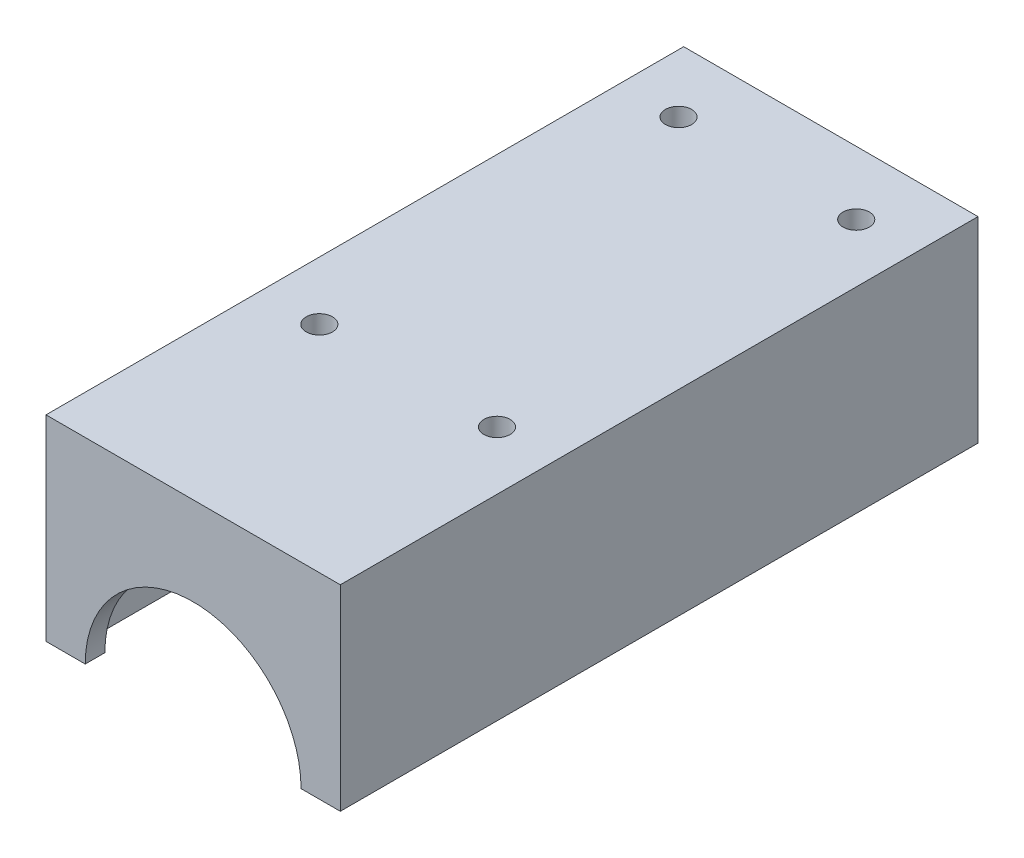
ISO-10303-21;
HEADER;
FILE_DESCRIPTION(('STEP AP214'),'2;1');
FILE_NAME('part.step','',(''),(''),'','','');
FILE_SCHEMA(('AUTOMOTIVE_DESIGN { 1 0 10303 214 1 1 1 1 }'));
ENDSEC;
DATA;
#1=APPLICATION_CONTEXT('core data for automotive mechanical design processes');
#2=APPLICATION_PROTOCOL_DEFINITION('international standard','automotive_design',2000,#1);
#3=PRODUCT_CONTEXT('',#1,'mechanical');
#4=PRODUCT('Part','Part','',(#3));
#5=PRODUCT_RELATED_PRODUCT_CATEGORY('part','',(#4));
#6=PRODUCT_DEFINITION_FORMATION('','',#4);
#7=PRODUCT_DEFINITION_CONTEXT('part definition',#1,'design');
#8=PRODUCT_DEFINITION('design','',#6,#7);
#9=PRODUCT_DEFINITION_SHAPE('','',#8);
#10=(LENGTH_UNIT() NAMED_UNIT(*) SI_UNIT(.MILLI.,.METRE.));
#11=(NAMED_UNIT(*) PLANE_ANGLE_UNIT() SI_UNIT($,.RADIAN.));
#12=(NAMED_UNIT(*) SI_UNIT($,.STERADIAN.) SOLID_ANGLE_UNIT());
#13=UNCERTAINTY_MEASURE_WITH_UNIT(LENGTH_MEASURE(1.E-05),#10,'distance_accuracy_value','');
#14=(GEOMETRIC_REPRESENTATION_CONTEXT(3) GLOBAL_UNCERTAINTY_ASSIGNED_CONTEXT((#13)) GLOBAL_UNIT_ASSIGNED_CONTEXT((#10,
#11,#12)) REPRESENTATION_CONTEXT('',''));
#15=CARTESIAN_POINT('',(0.,0.,0.));
#16=DIRECTION('',(0.,0.,1.));
#17=DIRECTION('',(1.,0.,0.));
#18=AXIS2_PLACEMENT_3D('',#15,#16,#17);
#19=CARTESIAN_POINT('',(0.,10.16,0.));
#20=DIRECTION('',(0.,-1.,0.));
#21=DIRECTION('',(0.,0.,-1.));
#22=AXIS2_PLACEMENT_3D('',#19,#20,#21);
#23=PLANE('',#22);
#24=CARTESIAN_POINT('',(-11.5,10.16,-33.06));
#25=DIRECTION('',(0.,-1.,0.));
#26=DIRECTION('',(1.,0.,0.));
#27=AXIS2_PLACEMENT_3D('',#24,#25,#26);
#28=CIRCLE('',#27,2.97);
#29=CARTESIAN_POINT('',(-8.53,10.16,-33.06));
#30=VERTEX_POINT('',#29);
#31=EDGE_CURVE('E386',#30,#30,#28,.T.);
#32=ORIENTED_EDGE('',*,*,#31,.F.);
#33=EDGE_LOOP('',(#32));
#34=FACE_BOUND('',#33,.T.);
#35=CARTESIAN_POINT('',(11.5,10.16,13.44));
#36=DIRECTION('',(0.,-1.,0.));
#37=DIRECTION('',(1.,0.,0.));
#38=AXIS2_PLACEMENT_3D('',#35,#36,#37);
#39=CIRCLE('',#38,2.97);
#40=CARTESIAN_POINT('',(14.47,10.16,13.44));
#41=VERTEX_POINT('',#40);
#42=EDGE_CURVE('E404',#41,#41,#39,.T.);
#43=ORIENTED_EDGE('',*,*,#42,.F.);
#44=EDGE_LOOP('',(#43));
#45=FACE_BOUND('',#44,.T.);
#46=DIRECTION('',(0.,0.,-1.));
#47=VECTOR('',#46,1.);
#48=CARTESIAN_POINT('',(16.51,10.16,0.));
#49=LINE('',#48,#47);
#50=CARTESIAN_POINT('',(16.51,10.16,38.735));
#51=VERTEX_POINT('',#50);
#52=CARTESIAN_POINT('',(16.51,10.16,-38.735));
#53=VERTEX_POINT('',#52);
#54=EDGE_CURVE('E455',#51,#53,#49,.T.);
#55=ORIENTED_EDGE('',*,*,#54,.F.);
#56=DIRECTION('',(1.,0.,0.));
#57=VECTOR('',#56,1.);
#58=CARTESIAN_POINT('',(0.,10.16,38.735));
#59=LINE('',#58,#57);
#60=CARTESIAN_POINT('',(-16.51,10.16,38.735));
#61=VERTEX_POINT('',#60);
#62=EDGE_CURVE('E466',#61,#51,#59,.T.);
#63=ORIENTED_EDGE('',*,*,#62,.F.);
#64=DIRECTION('',(0.,0.,1.));
#65=VECTOR('',#64,1.);
#66=CARTESIAN_POINT('',(-16.51,10.16,0.));
#67=LINE('',#66,#65);
#68=CARTESIAN_POINT('',(-16.51,10.16,-38.735));
#69=VERTEX_POINT('',#68);
#70=EDGE_CURVE('E472',#69,#61,#67,.T.);
#71=ORIENTED_EDGE('',*,*,#70,.F.);
#72=DIRECTION('',(-1.,0.,0.));
#73=VECTOR('',#72,1.);
#74=CARTESIAN_POINT('',(0.,10.16,-38.735));
#75=LINE('',#74,#73);
#76=EDGE_CURVE('E459',#53,#69,#75,.T.);
#77=ORIENTED_EDGE('',*,*,#76,.F.);
#78=EDGE_LOOP('',(#55,#63,#71,#77));
#79=FACE_BOUND('',#78,.T.);
#80=CARTESIAN_POINT('',(-11.5,10.16,13.44));
#81=DIRECTION('',(0.,-1.,0.));
#82=DIRECTION('',(1.,0.,0.));
#83=AXIS2_PLACEMENT_3D('',#80,#81,#82);
#84=CIRCLE('',#83,2.97);
#85=CARTESIAN_POINT('',(-8.53,10.16,13.44));
#86=VERTEX_POINT('',#85);
#87=EDGE_CURVE('E372',#86,#86,#84,.T.);
#88=ORIENTED_EDGE('',*,*,#87,.F.);
#89=EDGE_LOOP('',(#88));
#90=FACE_BOUND('',#89,.T.);
#91=CARTESIAN_POINT('',(11.5,10.16,-33.06));
#92=DIRECTION('',(0.,-1.,0.));
#93=DIRECTION('',(1.,0.,0.));
#94=AXIS2_PLACEMENT_3D('',#91,#92,#93);
#95=CIRCLE('',#94,2.97);
#96=CARTESIAN_POINT('',(14.47,10.16,-33.06));
#97=VERTEX_POINT('',#96);
#98=EDGE_CURVE('E397',#97,#97,#95,.T.);
#99=ORIENTED_EDGE('',*,*,#98,.F.);
#100=EDGE_LOOP('',(#99));
#101=FACE_BOUND('',#100,.T.);
#102=ADVANCED_FACE('F69',(#34,#45,#79,#90,#101),#23,.T.);
#103=CARTESIAN_POINT('',(0.,-12.7,0.));
#104=DIRECTION('',(0.,-1.,0.));
#105=DIRECTION('',(0.,0.,-1.));
#106=AXIS2_PLACEMENT_3D('',#103,#104,#105);
#107=PLANE('',#106);
#108=DIRECTION('',(0.,0.,-1.));
#109=VECTOR('',#108,1.);
#110=CARTESIAN_POINT('',(-13.97,-12.7,41.275));
#111=LINE('',#110,#109);
#112=CARTESIAN_POINT('',(-13.97,-12.7,41.275));
#113=VERTEX_POINT('',#112);
#114=CARTESIAN_POINT('',(-13.97,-12.7,38.735));
#115=VERTEX_POINT('',#114);
#116=EDGE_CURVE('E441',#113,#115,#111,.T.);
#117=ORIENTED_EDGE('',*,*,#116,.F.);
#118=DIRECTION('',(1.,0.,0.));
#119=VECTOR('',#118,1.);
#120=CARTESIAN_POINT('',(-19.05,-12.7,41.275));
#121=LINE('',#120,#119);
#122=CARTESIAN_POINT('',(-19.05,-12.7,41.275));
#123=VERTEX_POINT('',#122);
#124=EDGE_CURVE('E501',#123,#113,#121,.T.);
#125=ORIENTED_EDGE('',*,*,#124,.F.);
#126=DIRECTION('',(0.,0.,1.));
#127=VECTOR('',#126,1.);
#128=CARTESIAN_POINT('',(-19.05,-12.7,41.275));
#129=LINE('',#128,#127);
#130=CARTESIAN_POINT('',(-19.05,-12.7,-41.275));
#131=VERTEX_POINT('',#130);
#132=EDGE_CURVE('E519',#131,#123,#129,.T.);
#133=ORIENTED_EDGE('',*,*,#132,.F.);
#134=DIRECTION('',(-1.,0.,0.));
#135=VECTOR('',#134,1.);
#136=CARTESIAN_POINT('',(-19.05,-12.7,-41.275));
#137=LINE('',#136,#135);
#138=CARTESIAN_POINT('',(-13.97,-12.7,-41.275));
#139=VERTEX_POINT('',#138);
#140=EDGE_CURVE('E514',#139,#131,#137,.T.);
#141=ORIENTED_EDGE('',*,*,#140,.F.);
#142=CARTESIAN_POINT('',(-13.97,-12.7,-38.735));
#143=VERTEX_POINT('',#142);
#144=EDGE_CURVE('E446',#143,#139,#111,.T.);
#145=ORIENTED_EDGE('',*,*,#144,.F.);
#146=DIRECTION('',(-1.,0.,0.));
#147=VECTOR('',#146,1.);
#148=CARTESIAN_POINT('',(0.,-12.7,-38.735));
#149=LINE('',#148,#147);
#150=CARTESIAN_POINT('',(-16.51,-12.7,-38.735));
#151=VERTEX_POINT('',#150);
#152=EDGE_CURVE('E483',#143,#151,#149,.T.);
#153=ORIENTED_EDGE('',*,*,#152,.T.);
#154=DIRECTION('',(0.,0.,1.));
#155=VECTOR('',#154,1.);
#156=CARTESIAN_POINT('',(-16.51,-12.7,0.));
#157=LINE('',#156,#155);
#158=CARTESIAN_POINT('',(-16.51,-12.7,38.735));
#159=VERTEX_POINT('',#158);
#160=EDGE_CURVE('E488',#151,#159,#157,.T.);
#161=ORIENTED_EDGE('',*,*,#160,.T.);
#162=DIRECTION('',(1.,0.,0.));
#163=VECTOR('',#162,1.);
#164=CARTESIAN_POINT('',(0.,-12.7,38.735));
#165=LINE('',#164,#163);
#166=EDGE_CURVE('E460',#159,#115,#165,.T.);
#167=ORIENTED_EDGE('',*,*,#166,.T.);
#168=EDGE_LOOP('',(#117,#125,#133,#141,#145,#153,#161,#167));
#169=FACE_BOUND('',#168,.T.);
#170=ADVANCED_FACE('F595',(#169),#107,.T.);
#171=DIRECTION('',(0.,0.,-1.));
#172=VECTOR('',#171,1.);
#173=CARTESIAN_POINT('',(13.97,-12.7,41.275));
#174=LINE('',#173,#172);
#175=CARTESIAN_POINT('',(13.97,-12.7,-41.275));
#176=VERTEX_POINT('',#175);
#177=CARTESIAN_POINT('',(13.97,-12.7,-38.735));
#178=VERTEX_POINT('',#177);
#179=EDGE_CURVE('E442',#176,#178,#174,.F.);
#180=ORIENTED_EDGE('',*,*,#179,.F.);
#181=CARTESIAN_POINT('',(19.05,-12.7,-41.275));
#182=VERTEX_POINT('',#181);
#183=EDGE_CURVE('E515',#182,#176,#137,.T.);
#184=ORIENTED_EDGE('',*,*,#183,.F.);
#185=DIRECTION('',(0.,0.,-1.));
#186=VECTOR('',#185,1.);
#187=CARTESIAN_POINT('',(19.05,-12.7,41.275));
#188=LINE('',#187,#186);
#189=CARTESIAN_POINT('',(19.05,-12.7,41.275));
#190=VERTEX_POINT('',#189);
#191=EDGE_CURVE('E453',#190,#182,#188,.T.);
#192=ORIENTED_EDGE('',*,*,#191,.F.);
#193=CARTESIAN_POINT('',(13.97,-12.7,41.275));
#194=VERTEX_POINT('',#193);
#195=EDGE_CURVE('E522',#194,#190,#121,.T.);
#196=ORIENTED_EDGE('',*,*,#195,.F.);
#197=CARTESIAN_POINT('',(13.97,-12.7,38.735));
#198=VERTEX_POINT('',#197);
#199=EDGE_CURVE('E436',#198,#194,#174,.F.);
#200=ORIENTED_EDGE('',*,*,#199,.F.);
#201=CARTESIAN_POINT('',(16.51,-12.7,38.735));
#202=VERTEX_POINT('',#201);
#203=EDGE_CURVE('E487',#198,#202,#165,.T.);
#204=ORIENTED_EDGE('',*,*,#203,.T.);
#205=DIRECTION('',(0.,0.,-1.));
#206=VECTOR('',#205,1.);
#207=CARTESIAN_POINT('',(16.51,-12.7,0.));
#208=LINE('',#207,#206);
#209=CARTESIAN_POINT('',(16.51,-12.7,-38.735));
#210=VERTEX_POINT('',#209);
#211=EDGE_CURVE('E479',#202,#210,#208,.T.);
#212=ORIENTED_EDGE('',*,*,#211,.T.);
#213=EDGE_CURVE('E492',#210,#178,#149,.T.);
#214=ORIENTED_EDGE('',*,*,#213,.T.);
#215=EDGE_LOOP('',(#180,#184,#192,#196,#200,#204,#212,#214));
#216=FACE_BOUND('',#215,.T.);
#217=ADVANCED_FACE('F603',(#216),#107,.T.);
#218=CARTESIAN_POINT('',(19.05,12.7,41.275));
#219=DIRECTION('',(-1.,0.,0.));
#220=DIRECTION('',(0.,0.,1.));
#221=AXIS2_PLACEMENT_3D('',#218,#219,#220);
#222=PLANE('',#221);
#223=ORIENTED_EDGE('',*,*,#191,.T.);
#224=DIRECTION('',(0.,-1.,0.));
#225=VECTOR('',#224,1.);
#226=CARTESIAN_POINT('',(19.05,12.7,-41.275));
#227=LINE('',#226,#225);
#228=CARTESIAN_POINT('',(19.05,12.7,-41.275));
#229=VERTEX_POINT('',#228);
#230=EDGE_CURVE('E537',#229,#182,#227,.T.);
#231=ORIENTED_EDGE('',*,*,#230,.F.);
#232=DIRECTION('',(0.,0.,-1.));
#233=VECTOR('',#232,1.);
#234=CARTESIAN_POINT('',(19.05,12.7,41.275));
#235=LINE('',#234,#233);
#236=CARTESIAN_POINT('',(19.05,12.7,41.275));
#237=VERTEX_POINT('',#236);
#238=EDGE_CURVE('E496',#237,#229,#235,.T.);
#239=ORIENTED_EDGE('',*,*,#238,.F.);
#240=DIRECTION('',(0.,-1.,0.));
#241=VECTOR('',#240,1.);
#242=CARTESIAN_POINT('',(19.05,12.7,41.275));
#243=LINE('',#242,#241);
#244=EDGE_CURVE('E510',#237,#190,#243,.T.);
#245=ORIENTED_EDGE('',*,*,#244,.T.);
#246=EDGE_LOOP('',(#223,#231,#239,#245));
#247=FACE_BOUND('',#246,.T.);
#248=ADVANCED_FACE('F71',(#247),#222,.F.);
#249=CARTESIAN_POINT('',(-19.05,12.7,-41.275));
#250=DIRECTION('',(0.,0.,1.));
#251=DIRECTION('',(1.,0.,0.));
#252=AXIS2_PLACEMENT_3D('',#249,#250,#251);
#253=PLANE('',#252);
#254=ORIENTED_EDGE('',*,*,#183,.T.);
#255=CARTESIAN_POINT('',(0.,-12.7,-41.275));
#256=DIRECTION('',(0.,0.,-1.));
#257=DIRECTION('',(-1.,0.,0.));
#258=AXIS2_PLACEMENT_3D('',#255,#256,#257);
#259=CIRCLE('',#258,13.97);
#260=EDGE_CURVE('E431',#139,#176,#259,.T.);
#261=ORIENTED_EDGE('',*,*,#260,.F.);
#262=ORIENTED_EDGE('',*,*,#140,.T.);
#263=DIRECTION('',(0.,-1.,0.));
#264=VECTOR('',#263,1.);
#265=CARTESIAN_POINT('',(-19.05,12.7,-41.275));
#266=LINE('',#265,#264);
#267=CARTESIAN_POINT('',(-19.05,12.7,-41.275));
#268=VERTEX_POINT('',#267);
#269=EDGE_CURVE('E533',#268,#131,#266,.T.);
#270=ORIENTED_EDGE('',*,*,#269,.F.);
#271=DIRECTION('',(-1.,0.,0.));
#272=VECTOR('',#271,1.);
#273=CARTESIAN_POINT('',(-19.05,12.7,-41.275));
#274=LINE('',#273,#272);
#275=EDGE_CURVE('E500',#229,#268,#274,.T.);
#276=ORIENTED_EDGE('',*,*,#275,.F.);
#277=ORIENTED_EDGE('',*,*,#230,.T.);
#278=EDGE_LOOP('',(#254,#261,#262,#270,#276,#277));
#279=FACE_BOUND('',#278,.T.);
#280=ADVANCED_FACE('F624',(#279),#253,.F.);
#281=CARTESIAN_POINT('',(-19.05,12.7,41.275));
#282=DIRECTION('',(1.,0.,0.));
#283=DIRECTION('',(0.,0.,-1.));
#284=AXIS2_PLACEMENT_3D('',#281,#282,#283);
#285=PLANE('',#284);
#286=ORIENTED_EDGE('',*,*,#132,.T.);
#287=DIRECTION('',(0.,-1.,0.));
#288=VECTOR('',#287,1.);
#289=CARTESIAN_POINT('',(-19.05,12.7,41.275));
#290=LINE('',#289,#288);
#291=CARTESIAN_POINT('',(-19.05,12.7,41.275));
#292=VERTEX_POINT('',#291);
#293=EDGE_CURVE('E529',#292,#123,#290,.T.);
#294=ORIENTED_EDGE('',*,*,#293,.F.);
#295=DIRECTION('',(0.,0.,1.));
#296=VECTOR('',#295,1.);
#297=CARTESIAN_POINT('',(-19.05,12.7,41.275));
#298=LINE('',#297,#296);
#299=EDGE_CURVE('E504',#268,#292,#298,.T.);
#300=ORIENTED_EDGE('',*,*,#299,.F.);
#301=ORIENTED_EDGE('',*,*,#269,.T.);
#302=EDGE_LOOP('',(#286,#294,#300,#301));
#303=FACE_BOUND('',#302,.T.);
#304=ADVANCED_FACE('F621',(#303),#285,.F.);
#305=CARTESIAN_POINT('',(-19.05,12.7,41.275));
#306=DIRECTION('',(0.,0.,-1.));
#307=DIRECTION('',(-1.,0.,0.));
#308=AXIS2_PLACEMENT_3D('',#305,#306,#307);
#309=PLANE('',#308);
#310=ORIENTED_EDGE('',*,*,#124,.T.);
#311=CARTESIAN_POINT('',(0.,-12.7,41.275));
#312=DIRECTION('',(0.,0.,-1.));
#313=DIRECTION('',(-1.,0.,0.));
#314=AXIS2_PLACEMENT_3D('',#311,#312,#313);
#315=CIRCLE('',#314,13.97);
#316=EDGE_CURVE('E432',#113,#194,#315,.T.);
#317=ORIENTED_EDGE('',*,*,#316,.T.);
#318=ORIENTED_EDGE('',*,*,#195,.T.);
#319=ORIENTED_EDGE('',*,*,#244,.F.);
#320=DIRECTION('',(1.,0.,0.));
#321=VECTOR('',#320,1.);
#322=CARTESIAN_POINT('',(-19.05,12.7,41.275));
#323=LINE('',#322,#321);
#324=EDGE_CURVE('E507',#292,#237,#323,.T.);
#325=ORIENTED_EDGE('',*,*,#324,.F.);
#326=ORIENTED_EDGE('',*,*,#293,.T.);
#327=EDGE_LOOP('',(#310,#317,#318,#319,#325,#326));
#328=FACE_BOUND('',#327,.T.);
#329=ADVANCED_FACE('F614',(#328),#309,.F.);
#330=CARTESIAN_POINT('',(0.,12.7,0.));
#331=DIRECTION('',(0.,-1.,0.));
#332=DIRECTION('',(0.,0.,-1.));
#333=AXIS2_PLACEMENT_3D('',#330,#331,#332);
#334=PLANE('',#333);
#335=CARTESIAN_POINT('',(-11.5,12.7,13.44));
#336=DIRECTION('',(0.,-1.,0.));
#337=DIRECTION('',(0.,0.,-1.));
#338=AXIS2_PLACEMENT_3D('',#335,#336,#337);
#339=CIRCLE('',#338,1.7);
#340=CARTESIAN_POINT('',(-11.5,12.7,11.74));
#341=VERTEX_POINT('',#340);
#342=EDGE_CURVE('E415',#341,#341,#339,.T.);
#343=ORIENTED_EDGE('',*,*,#342,.T.);
#344=EDGE_LOOP('',(#343));
#345=FACE_BOUND('',#344,.T.);
#346=CARTESIAN_POINT('',(-11.5,12.7,-33.06));
#347=DIRECTION('',(0.,-1.,0.));
#348=DIRECTION('',(0.,0.,-1.));
#349=AXIS2_PLACEMENT_3D('',#346,#347,#348);
#350=CIRCLE('',#349,1.7);
#351=CARTESIAN_POINT('',(-11.5,12.7,-34.76));
#352=VERTEX_POINT('',#351);
#353=EDGE_CURVE('E421',#352,#352,#350,.T.);
#354=ORIENTED_EDGE('',*,*,#353,.T.);
#355=EDGE_LOOP('',(#354));
#356=FACE_BOUND('',#355,.T.);
#357=CARTESIAN_POINT('',(11.5,12.7,-33.06));
#358=DIRECTION('',(0.,-1.,0.));
#359=DIRECTION('',(0.,0.,-1.));
#360=AXIS2_PLACEMENT_3D('',#357,#358,#359);
#361=CIRCLE('',#360,1.7);
#362=CARTESIAN_POINT('',(11.5,12.7,-34.76));
#363=VERTEX_POINT('',#362);
#364=EDGE_CURVE('E416',#363,#363,#361,.T.);
#365=ORIENTED_EDGE('',*,*,#364,.T.);
#366=EDGE_LOOP('',(#365));
#367=FACE_BOUND('',#366,.T.);
#368=CARTESIAN_POINT('',(11.5,12.7,13.44));
#369=DIRECTION('',(0.,-1.,0.));
#370=DIRECTION('',(0.,0.,-1.));
#371=AXIS2_PLACEMENT_3D('',#368,#369,#370);
#372=CIRCLE('',#371,1.7);
#373=CARTESIAN_POINT('',(11.5,12.7,11.74));
#374=VERTEX_POINT('',#373);
#375=EDGE_CURVE('E420',#374,#374,#372,.T.);
#376=ORIENTED_EDGE('',*,*,#375,.T.);
#377=EDGE_LOOP('',(#376));
#378=FACE_BOUND('',#377,.T.);
#379=ORIENTED_EDGE('',*,*,#238,.T.);
#380=ORIENTED_EDGE('',*,*,#275,.T.);
#381=ORIENTED_EDGE('',*,*,#299,.T.);
#382=ORIENTED_EDGE('',*,*,#324,.T.);
#383=EDGE_LOOP('',(#379,#380,#381,#382));
#384=FACE_BOUND('',#383,.T.);
#385=ADVANCED_FACE('F612',(#345,#356,#367,#378,#384),#334,.F.);
#386=CARTESIAN_POINT('',(16.51,12.7,41.275));
#387=DIRECTION('',(-1.,0.,0.));
#388=DIRECTION('',(0.,0.,1.));
#389=AXIS2_PLACEMENT_3D('',#386,#387,#388);
#390=PLANE('',#389);
#391=ORIENTED_EDGE('',*,*,#211,.F.);
#392=DIRECTION('',(0.,-1.,0.));
#393=VECTOR('',#392,1.);
#394=CARTESIAN_POINT('',(16.51,12.7,38.735));
#395=LINE('',#394,#393);
#396=EDGE_CURVE('E461',#51,#202,#395,.T.);
#397=ORIENTED_EDGE('',*,*,#396,.F.);
#398=ORIENTED_EDGE('',*,*,#54,.T.);
#399=DIRECTION('',(0.,-1.,0.));
#400=VECTOR('',#399,1.);
#401=CARTESIAN_POINT('',(16.51,12.7,-38.735));
#402=LINE('',#401,#400);
#403=EDGE_CURVE('E449',#53,#210,#402,.T.);
#404=ORIENTED_EDGE('',*,*,#403,.T.);
#405=EDGE_LOOP('',(#391,#397,#398,#404));
#406=FACE_BOUND('',#405,.T.);
#407=ADVANCED_FACE('F613',(#406),#390,.T.);
#408=CARTESIAN_POINT('',(-19.05,12.7,-38.735));
#409=DIRECTION('',(0.,0.,1.));
#410=DIRECTION('',(1.,0.,0.));
#411=AXIS2_PLACEMENT_3D('',#408,#409,#410);
#412=PLANE('',#411);
#413=CARTESIAN_POINT('',(0.,-12.7,-38.735));
#414=DIRECTION('',(0.,0.,1.));
#415=DIRECTION('',(1.,0.,0.));
#416=AXIS2_PLACEMENT_3D('',#413,#414,#415);
#417=CIRCLE('',#416,13.97);
#418=EDGE_CURVE('E445',#178,#143,#417,.T.);
#419=ORIENTED_EDGE('',*,*,#418,.F.);
#420=ORIENTED_EDGE('',*,*,#213,.F.);
#421=ORIENTED_EDGE('',*,*,#403,.F.);
#422=ORIENTED_EDGE('',*,*,#76,.T.);
#423=DIRECTION('',(0.,-1.,0.));
#424=VECTOR('',#423,1.);
#425=CARTESIAN_POINT('',(-16.51,12.7,-38.735));
#426=LINE('',#425,#424);
#427=EDGE_CURVE('E454',#69,#151,#426,.T.);
#428=ORIENTED_EDGE('',*,*,#427,.T.);
#429=ORIENTED_EDGE('',*,*,#152,.F.);
#430=EDGE_LOOP('',(#419,#420,#421,#422,#428,#429));
#431=FACE_BOUND('',#430,.T.);
#432=ADVANCED_FACE('F649',(#431),#412,.T.);
#433=CARTESIAN_POINT('',(-16.51,12.7,41.275));
#434=DIRECTION('',(1.,0.,0.));
#435=DIRECTION('',(0.,0.,-1.));
#436=AXIS2_PLACEMENT_3D('',#433,#434,#435);
#437=PLANE('',#436);
#438=ORIENTED_EDGE('',*,*,#160,.F.);
#439=ORIENTED_EDGE('',*,*,#427,.F.);
#440=ORIENTED_EDGE('',*,*,#70,.T.);
#441=DIRECTION('',(0.,-1.,0.));
#442=VECTOR('',#441,1.);
#443=CARTESIAN_POINT('',(-16.51,12.7,38.735));
#444=LINE('',#443,#442);
#445=EDGE_CURVE('E465',#61,#159,#444,.T.);
#446=ORIENTED_EDGE('',*,*,#445,.T.);
#447=EDGE_LOOP('',(#438,#439,#440,#446));
#448=FACE_BOUND('',#447,.T.);
#449=ADVANCED_FACE('F679',(#448),#437,.T.);
#450=CARTESIAN_POINT('',(-19.05,12.7,38.735));
#451=DIRECTION('',(0.,0.,-1.));
#452=DIRECTION('',(-1.,0.,0.));
#453=AXIS2_PLACEMENT_3D('',#450,#451,#452);
#454=PLANE('',#453);
#455=CARTESIAN_POINT('',(0.,-12.7,38.735));
#456=DIRECTION('',(0.,0.,-1.));
#457=DIRECTION('',(-1.,0.,0.));
#458=AXIS2_PLACEMENT_3D('',#455,#456,#457);
#459=CIRCLE('',#458,13.97);
#460=EDGE_CURVE('E541',#115,#198,#459,.T.);
#461=ORIENTED_EDGE('',*,*,#460,.F.);
#462=ORIENTED_EDGE('',*,*,#166,.F.);
#463=ORIENTED_EDGE('',*,*,#445,.F.);
#464=ORIENTED_EDGE('',*,*,#62,.T.);
#465=ORIENTED_EDGE('',*,*,#396,.T.);
#466=ORIENTED_EDGE('',*,*,#203,.F.);
#467=EDGE_LOOP('',(#461,#462,#463,#464,#465,#466));
#468=FACE_BOUND('',#467,.T.);
#469=ADVANCED_FACE('F610',(#468),#454,.T.);
#470=CARTESIAN_POINT('',(0.,-12.7,41.275));
#471=DIRECTION('',(0.,0.,-1.));
#472=DIRECTION('',(-1.,0.,0.));
#473=AXIS2_PLACEMENT_3D('',#470,#471,#472);
#474=CYLINDRICAL_SURFACE('',#473,13.97);
#475=ORIENTED_EDGE('',*,*,#116,.T.);
#476=ORIENTED_EDGE('',*,*,#460,.T.);
#477=ORIENTED_EDGE('',*,*,#199,.T.);
#478=ORIENTED_EDGE('',*,*,#316,.F.);
#479=EDGE_LOOP('',(#475,#476,#477,#478));
#480=FACE_BOUND('',#479,.T.);
#481=ADVANCED_FACE('F667',(#480),#474,.F.);
#482=ORIENTED_EDGE('',*,*,#144,.T.);
#483=ORIENTED_EDGE('',*,*,#260,.T.);
#484=ORIENTED_EDGE('',*,*,#179,.T.);
#485=ORIENTED_EDGE('',*,*,#418,.T.);
#486=EDGE_LOOP('',(#482,#483,#484,#485));
#487=FACE_BOUND('',#486,.T.);
#488=ADVANCED_FACE('F643',(#487),#474,.F.);
#489=CARTESIAN_POINT('',(11.5,12.7,13.44));
#490=DIRECTION('',(0.,-1.,0.));
#491=DIRECTION('',(0.,0.,-1.));
#492=AXIS2_PLACEMENT_3D('',#489,#490,#491);
#493=CYLINDRICAL_SURFACE('',#492,1.7);
#494=CARTESIAN_POINT('',(11.5,-1.27,13.44));
#495=DIRECTION('',(0.,1.,0.));
#496=DIRECTION('',(-1.,0.,0.));
#497=AXIS2_PLACEMENT_3D('',#494,#495,#496);
#498=CIRCLE('',#497,1.7);
#499=CARTESIAN_POINT('',(10.16,-1.27,14.4861357464497));
#500=VERTEX_POINT('',#499);
#501=CARTESIAN_POINT('',(10.16,-1.27,12.3938642535503));
#502=VERTEX_POINT('',#501);
#503=EDGE_CURVE('E408',#500,#502,#498,.T.);
#504=ORIENTED_EDGE('',*,*,#503,.F.);
#505=DIRECTION('',(0.,-1.,0.));
#506=VECTOR('',#505,1.);
#507=CARTESIAN_POINT('',(10.16,12.7,14.4861357464497));
#508=LINE('',#507,#506);
#509=CARTESIAN_POINT('',(10.16,1.27,14.4861357464497));
#510=VERTEX_POINT('',#509);
#511=EDGE_CURVE('E320',#500,#510,#508,.F.);
#512=ORIENTED_EDGE('',*,*,#511,.T.);
#513=CARTESIAN_POINT('',(11.5,1.27,13.44));
#514=DIRECTION('',(0.,1.,0.));
#515=DIRECTION('',(-1.,0.,0.));
#516=AXIS2_PLACEMENT_3D('',#513,#514,#515);
#517=CIRCLE('',#516,1.7);
#518=CARTESIAN_POINT('',(10.16,1.27,12.3938642535502));
#519=VERTEX_POINT('',#518);
#520=EDGE_CURVE('E252',#510,#519,#517,.F.);
#521=ORIENTED_EDGE('',*,*,#520,.T.);
#522=DIRECTION('',(0.,-1.,0.));
#523=VECTOR('',#522,1.);
#524=CARTESIAN_POINT('',(10.16,12.7,12.3938642535503));
#525=LINE('',#524,#523);
#526=EDGE_CURVE('E316',#519,#502,#525,.T.);
#527=ORIENTED_EDGE('',*,*,#526,.T.);
#528=EDGE_LOOP('',(#504,#512,#521,#527));
#529=FACE_BOUND('',#528,.T.);
#530=ORIENTED_EDGE('',*,*,#375,.F.);
#531=EDGE_LOOP('',(#530));
#532=FACE_BOUND('',#531,.T.);
#533=ADVANCED_FACE('F710',(#529,#532),#493,.F.);
#534=CARTESIAN_POINT('',(11.5,12.7,-33.06));
#535=DIRECTION('',(0.,-1.,0.));
#536=DIRECTION('',(0.,0.,-1.));
#537=AXIS2_PLACEMENT_3D('',#534,#535,#536);
#538=CYLINDRICAL_SURFACE('',#537,1.7);
#539=ORIENTED_EDGE('',*,*,#364,.F.);
#540=EDGE_LOOP('',(#539));
#541=FACE_BOUND('',#540,.T.);
#542=CARTESIAN_POINT('',(11.5,-1.27,-33.06));
#543=DIRECTION('',(0.,1.,0.));
#544=DIRECTION('',(-1.,0.,0.));
#545=AXIS2_PLACEMENT_3D('',#542,#543,#544);
#546=CIRCLE('',#545,1.7);
#547=CARTESIAN_POINT('',(9.80000000000001,-1.27,-33.06));
#548=VERTEX_POINT('',#547);
#549=EDGE_CURVE('E367',#548,#548,#546,.T.);
#550=ORIENTED_EDGE('',*,*,#549,.F.);
#551=EDGE_LOOP('',(#550));
#552=FACE_BOUND('',#551,.T.);
#553=ADVANCED_FACE('F707',(#541,#552),#538,.F.);
#554=CARTESIAN_POINT('',(-11.5,12.7,-33.06));
#555=DIRECTION('',(0.,-1.,0.));
#556=DIRECTION('',(0.,0.,-1.));
#557=AXIS2_PLACEMENT_3D('',#554,#555,#556);
#558=CYLINDRICAL_SURFACE('',#557,1.7);
#559=ORIENTED_EDGE('',*,*,#353,.F.);
#560=EDGE_LOOP('',(#559));
#561=FACE_BOUND('',#560,.T.);
#562=CARTESIAN_POINT('',(-11.5,-1.27,-33.06));
#563=DIRECTION('',(0.,1.,0.));
#564=DIRECTION('',(-1.,0.,0.));
#565=AXIS2_PLACEMENT_3D('',#562,#563,#564);
#566=CIRCLE('',#565,1.7);
#567=CARTESIAN_POINT('',(-13.2,-1.27,-33.06));
#568=VERTEX_POINT('',#567);
#569=EDGE_CURVE('E382',#568,#568,#566,.T.);
#570=ORIENTED_EDGE('',*,*,#569,.F.);
#571=EDGE_LOOP('',(#570));
#572=FACE_BOUND('',#571,.T.);
#573=ADVANCED_FACE('F709',(#561,#572),#558,.F.);
#574=CARTESIAN_POINT('',(-11.5,12.7,13.44));
#575=DIRECTION('',(0.,-1.,0.));
#576=DIRECTION('',(0.,0.,-1.));
#577=AXIS2_PLACEMENT_3D('',#574,#575,#576);
#578=CYLINDRICAL_SURFACE('',#577,1.7);
#579=CARTESIAN_POINT('',(-11.5,-1.27,13.44));
#580=DIRECTION('',(0.,1.,0.));
#581=DIRECTION('',(-1.,0.,0.));
#582=AXIS2_PLACEMENT_3D('',#579,#580,#581);
#583=CIRCLE('',#582,1.7);
#584=CARTESIAN_POINT('',(-10.16,-1.27,12.3938642535502));
#585=VERTEX_POINT('',#584);
#586=CARTESIAN_POINT('',(-10.16,-1.27,14.4861357464498));
#587=VERTEX_POINT('',#586);
#588=EDGE_CURVE('E368',#585,#587,#583,.T.);
#589=ORIENTED_EDGE('',*,*,#588,.F.);
#590=DIRECTION('',(0.,-1.,0.));
#591=VECTOR('',#590,1.);
#592=CARTESIAN_POINT('',(-10.16,12.7,12.3938642535502));
#593=LINE('',#592,#591);
#594=CARTESIAN_POINT('',(-10.16,1.27,12.3938642535502));
#595=VERTEX_POINT('',#594);
#596=EDGE_CURVE('E363',#585,#595,#593,.F.);
#597=ORIENTED_EDGE('',*,*,#596,.T.);
#598=CARTESIAN_POINT('',(-11.5,1.27,13.44));
#599=DIRECTION('',(0.,1.,0.));
#600=DIRECTION('',(-1.,0.,0.));
#601=AXIS2_PLACEMENT_3D('',#598,#599,#600);
#602=CIRCLE('',#601,1.7);
#603=CARTESIAN_POINT('',(-10.16,1.27,14.4861357464498));
#604=VERTEX_POINT('',#603);
#605=EDGE_CURVE('E335',#595,#604,#602,.F.);
#606=ORIENTED_EDGE('',*,*,#605,.T.);
#607=DIRECTION('',(0.,-1.,0.));
#608=VECTOR('',#607,1.);
#609=CARTESIAN_POINT('',(-10.16,12.7,14.4861357464498));
#610=LINE('',#609,#608);
#611=EDGE_CURVE('E359',#604,#587,#610,.T.);
#612=ORIENTED_EDGE('',*,*,#611,.T.);
#613=EDGE_LOOP('',(#589,#597,#606,#612));
#614=FACE_BOUND('',#613,.T.);
#615=ORIENTED_EDGE('',*,*,#342,.F.);
#616=EDGE_LOOP('',(#615));
#617=FACE_BOUND('',#616,.T.);
#618=ADVANCED_FACE('F571',(#614,#617),#578,.F.);
#619=CARTESIAN_POINT('',(-11.5,-9.67042856049618,13.44));
#620=DIRECTION('',(0.,1.,0.));
#621=DIRECTION('',(0.,0.,1.));
#622=AXIS2_PLACEMENT_3D('',#619,#620,#621);
#623=CYLINDRICAL_SURFACE('',#622,2.97);
#624=CARTESIAN_POINT('',(-11.5,1.27,13.44));
#625=DIRECTION('',(0.,1.,0.));
#626=DIRECTION('',(-1.,0.,0.));
#627=AXIS2_PLACEMENT_3D('',#624,#625,#626);
#628=CIRCLE('',#627,2.97);
#629=CARTESIAN_POINT('',(-9.89659736809494,1.27,15.94));
#630=VERTEX_POINT('',#629);
#631=CARTESIAN_POINT('',(-10.16,1.27,10.7894717507636));
#632=VERTEX_POINT('',#631);
#633=EDGE_CURVE('E331',#630,#632,#628,.T.);
#634=ORIENTED_EDGE('',*,*,#633,.T.);
#635=DIRECTION('',(0.,1.,0.));
#636=VECTOR('',#635,1.);
#637=CARTESIAN_POINT('',(-10.16,-9.67042856049618,10.7894717507636));
#638=LINE('',#637,#636);
#639=CARTESIAN_POINT('',(-10.16,-1.27,10.7894717507636));
#640=VERTEX_POINT('',#639);
#641=EDGE_CURVE('E355',#632,#640,#638,.F.);
#642=ORIENTED_EDGE('',*,*,#641,.T.);
#643=CARTESIAN_POINT('',(-11.5,-1.27,13.44));
#644=DIRECTION('',(0.,1.,0.));
#645=DIRECTION('',(-1.,0.,0.));
#646=AXIS2_PLACEMENT_3D('',#643,#644,#645);
#647=CIRCLE('',#646,2.97);
#648=CARTESIAN_POINT('',(-9.89659736809494,-1.27,15.94));
#649=VERTEX_POINT('',#648);
#650=EDGE_CURVE('E374',#640,#649,#647,.T.);
#651=ORIENTED_EDGE('',*,*,#650,.T.);
#652=DIRECTION('',(0.,1.,0.));
#653=VECTOR('',#652,1.);
#654=CARTESIAN_POINT('',(-9.89659736809494,-9.67042856049618,15.94));
#655=LINE('',#654,#653);
#656=EDGE_CURVE('E85',#649,#630,#655,.T.);
#657=ORIENTED_EDGE('',*,*,#656,.T.);
#658=EDGE_LOOP('',(#634,#642,#651,#657));
#659=FACE_BOUND('',#658,.T.);
#660=ORIENTED_EDGE('',*,*,#87,.T.);
#661=EDGE_LOOP('',(#660));
#662=FACE_BOUND('',#661,.T.);
#663=ADVANCED_FACE('F577',(#659,#662),#623,.T.);
#664=CARTESIAN_POINT('',(0.,-1.27,-9.81));
#665=DIRECTION('',(0.,1.,0.));
#666=DIRECTION('',(1.,0.,0.));
#667=AXIS2_PLACEMENT_3D('',#664,#665,#666);
#668=PLANE('',#667);
#669=ORIENTED_EDGE('',*,*,#650,.F.);
#670=DIRECTION('',(0.,0.,-1.));
#671=VECTOR('',#670,1.);
#672=CARTESIAN_POINT('',(-10.16,-1.27,-15.94));
#673=LINE('',#672,#671);
#674=EDGE_CURVE('E295',#585,#640,#673,.T.);
#675=ORIENTED_EDGE('',*,*,#674,.F.);
#676=ORIENTED_EDGE('',*,*,#588,.T.);
#677=CARTESIAN_POINT('',(-10.16,-1.27,15.94));
#678=VERTEX_POINT('',#677);
#679=EDGE_CURVE('E297',#678,#587,#673,.T.);
#680=ORIENTED_EDGE('',*,*,#679,.F.);
#681=DIRECTION('',(-1.,0.,0.));
#682=VECTOR('',#681,1.);
#683=CARTESIAN_POINT('',(-10.16,-1.27,15.94));
#684=LINE('',#683,#682);
#685=EDGE_CURVE('E296',#649,#678,#684,.T.);
#686=ORIENTED_EDGE('',*,*,#685,.F.);
#687=EDGE_LOOP('',(#669,#675,#676,#680,#686));
#688=FACE_BOUND('',#687,.T.);
#689=ADVANCED_FACE('F567',(#688),#668,.F.);
#690=CARTESIAN_POINT('',(-11.5,-9.67042856049618,-33.06));
#691=DIRECTION('',(0.,1.,0.));
#692=DIRECTION('',(0.,0.,1.));
#693=AXIS2_PLACEMENT_3D('',#690,#691,#692);
#694=CYLINDRICAL_SURFACE('',#693,2.97);
#695=CARTESIAN_POINT('',(-11.5,-1.27,-33.06));
#696=DIRECTION('',(0.,1.,0.));
#697=DIRECTION('',(-1.,0.,0.));
#698=AXIS2_PLACEMENT_3D('',#695,#696,#697);
#699=CIRCLE('',#698,2.97);
#700=CARTESIAN_POINT('',(-9.525,-1.27,-35.2781692902031));
#701=VERTEX_POINT('',#700);
#702=CARTESIAN_POINT('',(-9.525,-1.27,-30.8418307097969));
#703=VERTEX_POINT('',#702);
#704=EDGE_CURVE('E373',#701,#703,#699,.T.);
#705=ORIENTED_EDGE('',*,*,#704,.T.);
#706=DIRECTION('',(0.,1.,0.));
#707=VECTOR('',#706,1.);
#708=CARTESIAN_POINT('',(-9.525,-9.67042856049618,-30.8418307097969));
#709=LINE('',#708,#707);
#710=CARTESIAN_POINT('',(-9.525,1.27,-30.8418307097969));
#711=VERTEX_POINT('',#710);
#712=EDGE_CURVE('E93',#703,#711,#709,.T.);
#713=ORIENTED_EDGE('',*,*,#712,.T.);
#714=CARTESIAN_POINT('',(-11.5,1.27,-33.06));
#715=DIRECTION('',(0.,1.,0.));
#716=DIRECTION('',(-1.,0.,0.));
#717=AXIS2_PLACEMENT_3D('',#714,#715,#716);
#718=CIRCLE('',#717,2.97);
#719=CARTESIAN_POINT('',(-9.525,1.27,-35.2781692902031));
#720=VERTEX_POINT('',#719);
#721=EDGE_CURVE('E327',#711,#720,#718,.T.);
#722=ORIENTED_EDGE('',*,*,#721,.T.);
#723=DIRECTION('',(0.,1.,0.));
#724=VECTOR('',#723,1.);
#725=CARTESIAN_POINT('',(-9.525,-9.67042856049618,-35.2781692902031));
#726=LINE('',#725,#724);
#727=EDGE_CURVE('E349',#720,#701,#726,.F.);
#728=ORIENTED_EDGE('',*,*,#727,.T.);
#729=EDGE_LOOP('',(#705,#713,#722,#728));
#730=FACE_BOUND('',#729,.T.);
#731=ORIENTED_EDGE('',*,*,#31,.T.);
#732=EDGE_LOOP('',(#731));
#733=FACE_BOUND('',#732,.T.);
#734=ADVANCED_FACE('F698',(#730,#733),#694,.T.);
#735=CARTESIAN_POINT('',(0.,-1.27,-9.81));
#736=DIRECTION('',(0.,1.,0.));
#737=DIRECTION('',(1.,0.,0.));
#738=AXIS2_PLACEMENT_3D('',#735,#736,#737);
#739=PLANE('',#738);
#740=ORIENTED_EDGE('',*,*,#569,.T.);
#741=EDGE_LOOP('',(#740));
#742=FACE_BOUND('',#741,.T.);
#743=ORIENTED_EDGE('',*,*,#704,.F.);
#744=DIRECTION('',(0.,0.,-1.));
#745=VECTOR('',#744,1.);
#746=CARTESIAN_POINT('',(-9.525,-1.27,-15.94));
#747=LINE('',#746,#745);
#748=EDGE_CURVE('E300',#703,#701,#747,.T.);
#749=ORIENTED_EDGE('',*,*,#748,.F.);
#750=EDGE_LOOP('',(#743,#749));
#751=FACE_BOUND('',#750,.T.);
#752=ADVANCED_FACE('F689',(#742,#751),#739,.F.);
#753=CARTESIAN_POINT('',(11.5,-9.67042856049618,-33.06));
#754=DIRECTION('',(0.,1.,0.));
#755=DIRECTION('',(0.,0.,1.));
#756=AXIS2_PLACEMENT_3D('',#753,#754,#755);
#757=CYLINDRICAL_SURFACE('',#756,2.97);
#758=CARTESIAN_POINT('',(11.5,-1.27,-33.06));
#759=DIRECTION('',(0.,1.,0.));
#760=DIRECTION('',(-1.,0.,0.));
#761=AXIS2_PLACEMENT_3D('',#758,#759,#760);
#762=CIRCLE('',#761,2.97);
#763=CARTESIAN_POINT('',(9.525,-1.27,-30.8418307097969));
#764=VERTEX_POINT('',#763);
#765=CARTESIAN_POINT('',(9.525,-1.27,-35.2781692902031));
#766=VERTEX_POINT('',#765);
#767=EDGE_CURVE('E387',#764,#766,#762,.T.);
#768=ORIENTED_EDGE('',*,*,#767,.T.);
#769=DIRECTION('',(0.,1.,0.));
#770=VECTOR('',#769,1.);
#771=CARTESIAN_POINT('',(9.52500000000001,-9.67042856049618,-35.2781692902031));
#772=LINE('',#771,#770);
#773=CARTESIAN_POINT('',(9.525,1.27,-35.2781692902031));
#774=VERTEX_POINT('',#773);
#775=EDGE_CURVE('E345',#766,#774,#772,.T.);
#776=ORIENTED_EDGE('',*,*,#775,.T.);
#777=CARTESIAN_POINT('',(11.5,1.27,-33.06));
#778=DIRECTION('',(0.,1.,0.));
#779=DIRECTION('',(-1.,0.,0.));
#780=AXIS2_PLACEMENT_3D('',#777,#778,#779);
#781=CIRCLE('',#780,2.97);
#782=CARTESIAN_POINT('',(9.525,1.27,-30.8418307097969));
#783=VERTEX_POINT('',#782);
#784=EDGE_CURVE('E323',#774,#783,#781,.T.);
#785=ORIENTED_EDGE('',*,*,#784,.T.);
#786=DIRECTION('',(0.,1.,0.));
#787=VECTOR('',#786,1.);
#788=CARTESIAN_POINT('',(9.52500000000001,-9.67042856049618,-30.8418307097969));
#789=LINE('',#788,#787);
#790=EDGE_CURVE('E341',#783,#764,#789,.F.);
#791=ORIENTED_EDGE('',*,*,#790,.T.);
#792=EDGE_LOOP('',(#768,#776,#785,#791));
#793=FACE_BOUND('',#792,.T.);
#794=ORIENTED_EDGE('',*,*,#98,.T.);
#795=EDGE_LOOP('',(#794));
#796=FACE_BOUND('',#795,.T.);
#797=ADVANCED_FACE('F686',(#793,#796),#757,.T.);
#798=CARTESIAN_POINT('',(0.,-1.27,-9.81));
#799=DIRECTION('',(0.,1.,0.));
#800=DIRECTION('',(1.,0.,0.));
#801=AXIS2_PLACEMENT_3D('',#798,#799,#800);
#802=PLANE('',#801);
#803=ORIENTED_EDGE('',*,*,#549,.T.);
#804=EDGE_LOOP('',(#803));
#805=FACE_BOUND('',#804,.T.);
#806=ORIENTED_EDGE('',*,*,#767,.F.);
#807=DIRECTION('',(0.,0.,1.));
#808=VECTOR('',#807,1.);
#809=CARTESIAN_POINT('',(9.525,-1.27,-15.94));
#810=LINE('',#809,#808);
#811=EDGE_CURVE('E257',#766,#764,#810,.T.);
#812=ORIENTED_EDGE('',*,*,#811,.F.);
#813=EDGE_LOOP('',(#806,#812));
#814=FACE_BOUND('',#813,.T.);
#815=ADVANCED_FACE('F688',(#805,#814),#802,.F.);
#816=CARTESIAN_POINT('',(11.5,-9.67042856049618,13.44));
#817=DIRECTION('',(0.,1.,0.));
#818=DIRECTION('',(0.,0.,1.));
#819=AXIS2_PLACEMENT_3D('',#816,#817,#818);
#820=CYLINDRICAL_SURFACE('',#819,2.97);
#821=CARTESIAN_POINT('',(11.5,-1.27,13.44));
#822=DIRECTION('',(0.,1.,0.));
#823=DIRECTION('',(-1.,0.,0.));
#824=AXIS2_PLACEMENT_3D('',#821,#822,#823);
#825=CIRCLE('',#824,2.97);
#826=CARTESIAN_POINT('',(9.89659736809495,-1.27,15.94));
#827=VERTEX_POINT('',#826);
#828=CARTESIAN_POINT('',(10.16,-1.27,10.7894717507636));
#829=VERTEX_POINT('',#828);
#830=EDGE_CURVE('E378',#827,#829,#825,.T.);
#831=ORIENTED_EDGE('',*,*,#830,.T.);
#832=DIRECTION('',(0.,1.,0.));
#833=VECTOR('',#832,1.);
#834=CARTESIAN_POINT('',(10.16,-9.67042856049618,10.7894717507636));
#835=LINE('',#834,#833);
#836=CARTESIAN_POINT('',(10.16,1.27,10.7894717507636));
#837=VERTEX_POINT('',#836);
#838=EDGE_CURVE('E312',#829,#837,#835,.T.);
#839=ORIENTED_EDGE('',*,*,#838,.T.);
#840=CARTESIAN_POINT('',(11.5,1.27,13.44));
#841=DIRECTION('',(0.,1.,0.));
#842=DIRECTION('',(-1.,0.,0.));
#843=AXIS2_PLACEMENT_3D('',#840,#841,#842);
#844=CIRCLE('',#843,2.97);
#845=CARTESIAN_POINT('',(9.89659736809495,1.27,15.94));
#846=VERTEX_POINT('',#845);
#847=EDGE_CURVE('E12',#837,#846,#844,.T.);
#848=ORIENTED_EDGE('',*,*,#847,.T.);
#849=DIRECTION('',(0.,1.,0.));
#850=VECTOR('',#849,1.);
#851=CARTESIAN_POINT('',(9.89659736809495,-9.67042856049618,15.94));
#852=LINE('',#851,#850);
#853=EDGE_CURVE('E272',#846,#827,#852,.F.);
#854=ORIENTED_EDGE('',*,*,#853,.T.);
#855=EDGE_LOOP('',(#831,#839,#848,#854));
#856=FACE_BOUND('',#855,.T.);
#857=ORIENTED_EDGE('',*,*,#42,.T.);
#858=EDGE_LOOP('',(#857));
#859=FACE_BOUND('',#858,.T.);
#860=ADVANCED_FACE('F552',(#856,#859),#820,.T.);
#861=CARTESIAN_POINT('',(0.,-1.27,-9.81));
#862=DIRECTION('',(0.,1.,0.));
#863=DIRECTION('',(1.,0.,0.));
#864=AXIS2_PLACEMENT_3D('',#861,#862,#863);
#865=PLANE('',#864);
#866=ORIENTED_EDGE('',*,*,#503,.T.);
#867=DIRECTION('',(0.,0.,-1.));
#868=VECTOR('',#867,1.);
#869=CARTESIAN_POINT('',(10.16,-1.27,-9.81));
#870=LINE('',#869,#868);
#871=EDGE_CURVE('E78',#502,#829,#870,.T.);
#872=ORIENTED_EDGE('',*,*,#871,.T.);
#873=ORIENTED_EDGE('',*,*,#830,.F.);
#874=CARTESIAN_POINT('',(10.16,-1.27,15.94));
#875=VERTEX_POINT('',#874);
#876=EDGE_CURVE('E292',#875,#827,#684,.T.);
#877=ORIENTED_EDGE('',*,*,#876,.F.);
#878=EDGE_CURVE('E263',#875,#500,#870,.T.);
#879=ORIENTED_EDGE('',*,*,#878,.T.);
#880=EDGE_LOOP('',(#866,#872,#873,#877,#879));
#881=FACE_BOUND('',#880,.T.);
#882=ADVANCED_FACE('F549',(#881),#865,.F.);
#883=CARTESIAN_POINT('',(10.16,1.27,-15.94));
#884=DIRECTION('',(1.,0.,0.));
#885=DIRECTION('',(0.,1.,0.));
#886=AXIS2_PLACEMENT_3D('',#883,#884,#885);
#887=PLANE('',#886);
#888=DIRECTION('',(0.,0.,1.));
#889=VECTOR('',#888,1.);
#890=CARTESIAN_POINT('',(10.16,1.27,-15.94));
#891=LINE('',#890,#889);
#892=EDGE_CURVE('E256',#837,#519,#891,.T.);
#893=ORIENTED_EDGE('',*,*,#892,.F.);
#894=ORIENTED_EDGE('',*,*,#838,.F.);
#895=ORIENTED_EDGE('',*,*,#871,.F.);
#896=ORIENTED_EDGE('',*,*,#526,.F.);
#897=EDGE_LOOP('',(#893,#894,#895,#896));
#898=FACE_BOUND('',#897,.T.);
#899=ADVANCED_FACE('F555',(#898),#887,.F.);
#900=CARTESIAN_POINT('',(-10.16,1.27,15.94));
#901=DIRECTION('',(0.,0.,1.));
#902=DIRECTION('',(1.,0.,0.));
#903=AXIS2_PLACEMENT_3D('',#900,#901,#902);
#904=PLANE('',#903);
#905=DIRECTION('',(-1.,0.,0.));
#906=VECTOR('',#905,1.);
#907=CARTESIAN_POINT('',(-10.16,1.27,15.94));
#908=LINE('',#907,#906);
#909=CARTESIAN_POINT('',(10.16,1.27,15.94));
#910=VERTEX_POINT('',#909);
#911=EDGE_CURVE('E249',#910,#846,#908,.T.);
#912=ORIENTED_EDGE('',*,*,#911,.F.);
#913=DIRECTION('',(0.,-1.,0.));
#914=VECTOR('',#913,1.);
#915=CARTESIAN_POINT('',(10.16,1.27,15.94));
#916=LINE('',#915,#914);
#917=EDGE_CURVE('E260',#910,#875,#916,.T.);
#918=ORIENTED_EDGE('',*,*,#917,.T.);
#919=ORIENTED_EDGE('',*,*,#876,.T.);
#920=ORIENTED_EDGE('',*,*,#853,.F.);
#921=EDGE_LOOP('',(#912,#918,#919,#920));
#922=FACE_BOUND('',#921,.T.);
#923=ADVANCED_FACE('F270',(#922),#904,.F.);
#924=ORIENTED_EDGE('',*,*,#878,.F.);
#925=ORIENTED_EDGE('',*,*,#917,.F.);
#926=EDGE_CURVE('E245',#510,#910,#891,.T.);
#927=ORIENTED_EDGE('',*,*,#926,.F.);
#928=ORIENTED_EDGE('',*,*,#511,.F.);
#929=EDGE_LOOP('',(#924,#925,#927,#928));
#930=FACE_BOUND('',#929,.T.);
#931=ADVANCED_FACE('F261',(#930),#887,.F.);
#932=CARTESIAN_POINT('',(0.,1.27,0.));
#933=DIRECTION('',(0.,1.,0.));
#934=DIRECTION('',(-1.,0.,0.));
#935=AXIS2_PLACEMENT_3D('',#932,#933,#934);
#936=PLANE('',#935);
#937=ORIENTED_EDGE('',*,*,#926,.T.);
#938=ORIENTED_EDGE('',*,*,#911,.T.);
#939=ORIENTED_EDGE('',*,*,#847,.F.);
#940=ORIENTED_EDGE('',*,*,#892,.T.);
#941=ORIENTED_EDGE('',*,*,#520,.F.);
#942=EDGE_LOOP('',(#937,#938,#939,#940,#941));
#943=FACE_BOUND('',#942,.T.);
#944=ADVANCED_FACE('F247',(#943),#936,.F.);
#945=CARTESIAN_POINT('',(9.525,1.27,-15.94));
#946=DIRECTION('',(1.,0.,0.));
#947=DIRECTION('',(0.,1.,0.));
#948=AXIS2_PLACEMENT_3D('',#945,#946,#947);
#949=PLANE('',#948);
#950=ORIENTED_EDGE('',*,*,#811,.T.);
#951=ORIENTED_EDGE('',*,*,#790,.F.);
#952=DIRECTION('',(0.,0.,1.));
#953=VECTOR('',#952,1.);
#954=CARTESIAN_POINT('',(9.525,1.27,-15.94));
#955=LINE('',#954,#953);
#956=EDGE_CURVE('E268',#774,#783,#955,.T.);
#957=ORIENTED_EDGE('',*,*,#956,.F.);
#958=ORIENTED_EDGE('',*,*,#775,.F.);
#959=EDGE_LOOP('',(#950,#951,#957,#958));
#960=FACE_BOUND('',#959,.T.);
#961=ADVANCED_FACE('F882',(#960),#949,.F.);
#962=ORIENTED_EDGE('',*,*,#956,.T.);
#963=ORIENTED_EDGE('',*,*,#784,.F.);
#964=EDGE_LOOP('',(#962,#963));
#965=FACE_BOUND('',#964,.T.);
#966=ADVANCED_FACE('F591',(#965),#936,.F.);
#967=CARTESIAN_POINT('',(-9.525,1.27,-15.94));
#968=DIRECTION('',(-1.,0.,0.));
#969=DIRECTION('',(0.,-1.,0.));
#970=AXIS2_PLACEMENT_3D('',#967,#968,#969);
#971=PLANE('',#970);
#972=ORIENTED_EDGE('',*,*,#748,.T.);
#973=ORIENTED_EDGE('',*,*,#727,.F.);
#974=DIRECTION('',(0.,0.,-1.));
#975=VECTOR('',#974,1.);
#976=CARTESIAN_POINT('',(-9.525,1.27,-15.94));
#977=LINE('',#976,#975);
#978=EDGE_CURVE('E285',#711,#720,#977,.T.);
#979=ORIENTED_EDGE('',*,*,#978,.F.);
#980=ORIENTED_EDGE('',*,*,#712,.F.);
#981=EDGE_LOOP('',(#972,#973,#979,#980));
#982=FACE_BOUND('',#981,.T.);
#983=ADVANCED_FACE('F588',(#982),#971,.F.);
#984=ORIENTED_EDGE('',*,*,#978,.T.);
#985=ORIENTED_EDGE('',*,*,#721,.F.);
#986=EDGE_LOOP('',(#984,#985));
#987=FACE_BOUND('',#986,.T.);
#988=ADVANCED_FACE('F582',(#987),#936,.F.);
#989=CARTESIAN_POINT('',(-10.16,1.27,-15.94));
#990=DIRECTION('',(-1.,0.,0.));
#991=DIRECTION('',(0.,-1.,0.));
#992=AXIS2_PLACEMENT_3D('',#989,#990,#991);
#993=PLANE('',#992);
#994=ORIENTED_EDGE('',*,*,#674,.T.);
#995=ORIENTED_EDGE('',*,*,#641,.F.);
#996=DIRECTION('',(0.,0.,-1.));
#997=VECTOR('',#996,1.);
#998=CARTESIAN_POINT('',(-10.16,1.27,-15.94));
#999=LINE('',#998,#997);
#1000=EDGE_CURVE('E274',#595,#632,#999,.T.);
#1001=ORIENTED_EDGE('',*,*,#1000,.F.);
#1002=ORIENTED_EDGE('',*,*,#596,.F.);
#1003=EDGE_LOOP('',(#994,#995,#1001,#1002));
#1004=FACE_BOUND('',#1003,.T.);
#1005=ADVANCED_FACE('F580',(#1004),#993,.F.);
#1006=CARTESIAN_POINT('',(-10.16,1.27,15.94));
#1007=VERTEX_POINT('',#1006);
#1008=EDGE_CURVE('E280',#1007,#604,#999,.T.);
#1009=ORIENTED_EDGE('',*,*,#1008,.F.);
#1010=DIRECTION('',(0.,-1.,0.));
#1011=VECTOR('',#1010,1.);
#1012=CARTESIAN_POINT('',(-10.16,1.27,15.94));
#1013=LINE('',#1012,#1011);
#1014=EDGE_CURVE('E267',#1007,#678,#1013,.T.);
#1015=ORIENTED_EDGE('',*,*,#1014,.T.);
#1016=ORIENTED_EDGE('',*,*,#679,.T.);
#1017=ORIENTED_EDGE('',*,*,#611,.F.);
#1018=EDGE_LOOP('',(#1009,#1015,#1016,#1017));
#1019=FACE_BOUND('',#1018,.T.);
#1020=ADVANCED_FACE('F566',(#1019),#993,.F.);
#1021=ORIENTED_EDGE('',*,*,#1000,.T.);
#1022=ORIENTED_EDGE('',*,*,#633,.F.);
#1023=EDGE_CURVE('E275',#630,#1007,#908,.T.);
#1024=ORIENTED_EDGE('',*,*,#1023,.T.);
#1025=ORIENTED_EDGE('',*,*,#1008,.T.);
#1026=ORIENTED_EDGE('',*,*,#605,.F.);
#1027=EDGE_LOOP('',(#1021,#1022,#1024,#1025,#1026));
#1028=FACE_BOUND('',#1027,.T.);
#1029=ADVANCED_FACE('F574',(#1028),#936,.F.);
#1030=ORIENTED_EDGE('',*,*,#685,.T.);
#1031=ORIENTED_EDGE('',*,*,#1014,.F.);
#1032=ORIENTED_EDGE('',*,*,#1023,.F.);
#1033=ORIENTED_EDGE('',*,*,#656,.F.);
#1034=EDGE_LOOP('',(#1030,#1031,#1032,#1033));
#1035=FACE_BOUND('',#1034,.T.);
#1036=ADVANCED_FACE('F560',(#1035),#904,.F.);
#1037=CLOSED_SHELL('',(#102,#170,#217,#248,#280,#304,#329,#385,#407,#432,#449,#469,#481,#488,
#533,#553,#573,#618,#663,#689,#734,#752,#797,#815,#860,#882,#899,#923,#931,#944,#961,#966,#983,
#988,#1005,#1020,#1029,#1036));
#1038=MANIFOLD_SOLID_BREP('B2',#1037);
#1039=ADVANCED_BREP_SHAPE_REPRESENTATION('',(#18,#1038),#14);
#1040=SHAPE_DEFINITION_REPRESENTATION(#9,#1039);
ENDSEC;
END-ISO-10303-21;
